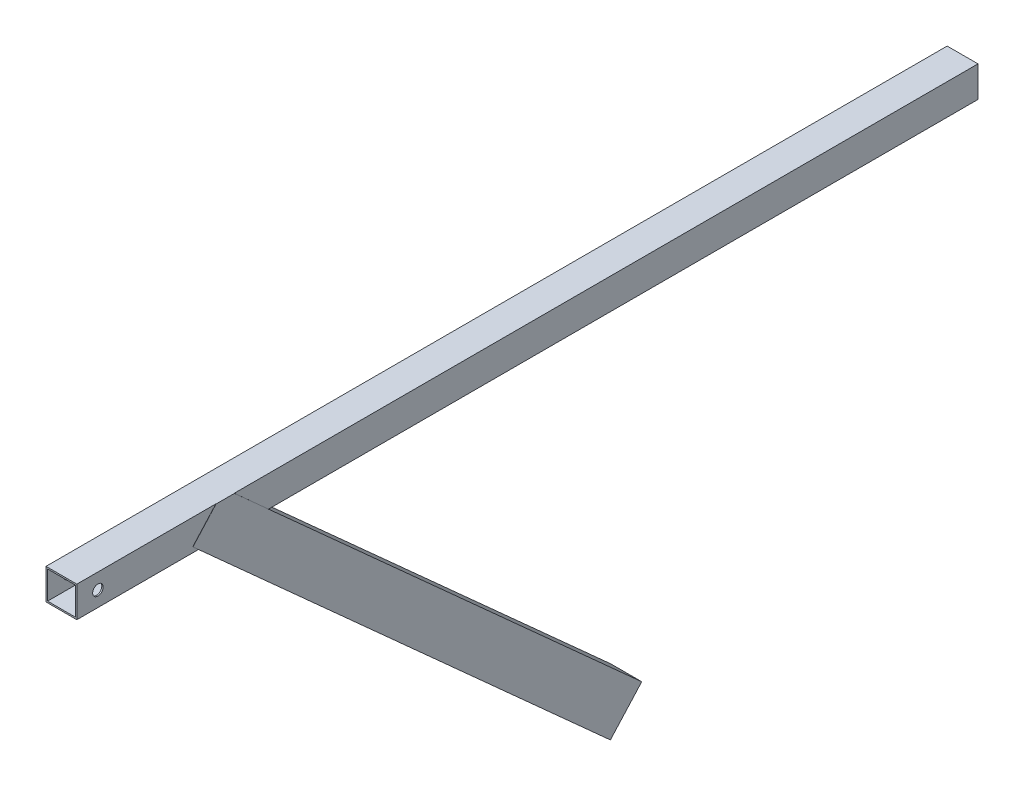
ISO-10303-21;
HEADER;
FILE_DESCRIPTION(('STEP AP214'),'2;1');
FILE_NAME('part.step','',(''),(''),'','','');
FILE_SCHEMA(('AUTOMOTIVE_DESIGN { 1 0 10303 214 1 1 1 1 }'));
ENDSEC;
DATA;
#1=APPLICATION_CONTEXT('core data for automotive mechanical design processes');
#2=APPLICATION_PROTOCOL_DEFINITION('international standard','automotive_design',2000,#1);
#3=PRODUCT_CONTEXT('',#1,'mechanical');
#4=PRODUCT('Part','Part','',(#3));
#5=PRODUCT_RELATED_PRODUCT_CATEGORY('part','',(#4));
#6=PRODUCT_DEFINITION_FORMATION('','',#4);
#7=PRODUCT_DEFINITION_CONTEXT('part definition',#1,'design');
#8=PRODUCT_DEFINITION('design','',#6,#7);
#9=PRODUCT_DEFINITION_SHAPE('','',#8);
#10=(LENGTH_UNIT() NAMED_UNIT(*) SI_UNIT(.MILLI.,.METRE.));
#11=(NAMED_UNIT(*) PLANE_ANGLE_UNIT() SI_UNIT($,.RADIAN.));
#12=(NAMED_UNIT(*) SI_UNIT($,.STERADIAN.) SOLID_ANGLE_UNIT());
#13=UNCERTAINTY_MEASURE_WITH_UNIT(LENGTH_MEASURE(1.E-05),#10,'distance_accuracy_value','');
#14=(GEOMETRIC_REPRESENTATION_CONTEXT(3) GLOBAL_UNCERTAINTY_ASSIGNED_CONTEXT((#13)) GLOBAL_UNIT_ASSIGNED_CONTEXT((#10,
#11,#12)) REPRESENTATION_CONTEXT('',''));
#15=CARTESIAN_POINT('',(0.,0.,0.));
#16=DIRECTION('',(0.,0.,1.));
#17=DIRECTION('',(1.,0.,0.));
#18=AXIS2_PLACEMENT_3D('',#15,#16,#17);
#19=CARTESIAN_POINT('',(0.,0.,385.));
#20=DIRECTION('',(-1.,0.,0.));
#21=DIRECTION('',(0.,0.,1.));
#22=AXIS2_PLACEMENT_3D('',#19,#20,#21);
#23=PLANE('',#22);
#24=DIRECTION('',(0.,0.669130606358841,0.74314482547741));
#25=VECTOR('',#24,1.);
#26=CARTESIAN_POINT('',(0.,81.4257064412463,311.683964610497));
#27=LINE('',#26,#25);
#28=CARTESIAN_POINT('',(0.,0.,221.251556008036));
#29=VERTEX_POINT('',#28);
#30=CARTESIAN_POINT('',(0.,26.3521827828498,250.518619999737));
#31=VERTEX_POINT('',#30);
#32=EDGE_CURVE('E247',#29,#31,#27,.T.);
#33=ORIENTED_EDGE('',*,*,#32,.F.);
#34=DIRECTION('',(0.,0.,-1.));
#35=VECTOR('',#34,1.);
#36=CARTESIAN_POINT('',(0.,0.,385.));
#37=LINE('',#36,#35);
#38=CARTESIAN_POINT('',(0.,0.,-385.));
#39=VERTEX_POINT('',#38);
#40=EDGE_CURVE('E388',#29,#39,#37,.T.);
#41=ORIENTED_EDGE('',*,*,#40,.T.);
#42=DIRECTION('',(0.,1.,0.));
#43=VECTOR('',#42,1.);
#44=CARTESIAN_POINT('',(0.,0.,-385.));
#45=LINE('',#44,#43);
#46=CARTESIAN_POINT('',(0.,26.3521827828498,-385.));
#47=VERTEX_POINT('',#46);
#48=EDGE_CURVE('E373',#39,#47,#45,.T.);
#49=ORIENTED_EDGE('',*,*,#48,.T.);
#50=DIRECTION('',(0.,0.,-1.));
#51=VECTOR('',#50,1.);
#52=CARTESIAN_POINT('',(0.,26.3521827828499,385.));
#53=LINE('',#52,#51);
#54=EDGE_CURVE('E412',#31,#47,#53,.T.);
#55=ORIENTED_EDGE('',*,*,#54,.F.);
#56=EDGE_LOOP('',(#33,#41,#49,#55));
#57=FACE_BOUND('',#56,.T.);
#58=ADVANCED_FACE('F39',(#57),#23,.F.);
#59=CARTESIAN_POINT('',(0.,0.,385.));
#60=DIRECTION('',(0.,1.,0.));
#61=DIRECTION('',(0.,0.,1.));
#62=AXIS2_PLACEMENT_3D('',#59,#60,#61);
#63=PLANE('',#62);
#64=DIRECTION('',(-1.,0.,0.));
#65=VECTOR('',#64,1.);
#66=CARTESIAN_POINT('',(0.,0.,281.030618002622));
#67=LINE('',#66,#65);
#68=CARTESIAN_POINT('',(0.,0.,281.030618002622));
#69=VERTEX_POINT('',#68);
#70=CARTESIAN_POINT('',(-26.3521827828498,-1.11022302462518E-13,281.030618002622));
#71=VERTEX_POINT('',#70);
#72=EDGE_CURVE('E300',#69,#71,#67,.T.);
#73=ORIENTED_EDGE('',*,*,#72,.F.);
#74=CARTESIAN_POINT('',(0.,0.,385.));
#75=VERTEX_POINT('',#74);
#76=EDGE_CURVE('E402',#75,#69,#37,.T.);
#77=ORIENTED_EDGE('',*,*,#76,.F.);
#78=DIRECTION('',(1.,0.,0.));
#79=VECTOR('',#78,1.);
#80=CARTESIAN_POINT('',(0.,0.,385.));
#81=LINE('',#80,#79);
#82=CARTESIAN_POINT('',(-26.3521827828498,-1.11022302462516E-13,385.));
#83=VERTEX_POINT('',#82);
#84=EDGE_CURVE('E385',#83,#75,#81,.T.);
#85=ORIENTED_EDGE('',*,*,#84,.F.);
#86=DIRECTION('',(0.,0.,-1.));
#87=VECTOR('',#86,1.);
#88=CARTESIAN_POINT('',(-26.3521827828498,-1.11022302462516E-13,385.));
#89=LINE('',#88,#87);
#90=EDGE_CURVE('E406',#83,#71,#89,.T.);
#91=ORIENTED_EDGE('',*,*,#90,.T.);
#92=EDGE_LOOP('',(#73,#77,#85,#91));
#93=FACE_BOUND('',#92,.T.);
#94=ADVANCED_FACE('F505',(#93),#63,.F.);
#95=DIRECTION('',(1.,0.,0.));
#96=VECTOR('',#95,1.);
#97=CARTESIAN_POINT('',(0.,0.,221.251556008036));
#98=LINE('',#97,#96);
#99=CARTESIAN_POINT('',(-26.3521827828498,-1.1102230246252E-13,221.251556008036));
#100=VERTEX_POINT('',#99);
#101=EDGE_CURVE('E291',#100,#29,#98,.T.);
#102=ORIENTED_EDGE('',*,*,#101,.F.);
#103=CARTESIAN_POINT('',(-26.3521827828498,-2.22044604925031E-13,-385.));
#104=VERTEX_POINT('',#103);
#105=EDGE_CURVE('E405',#100,#104,#89,.T.);
#106=ORIENTED_EDGE('',*,*,#105,.T.);
#107=DIRECTION('',(1.,0.,0.));
#108=VECTOR('',#107,1.);
#109=CARTESIAN_POINT('',(0.,0.,-385.));
#110=LINE('',#109,#108);
#111=EDGE_CURVE('E379',#104,#39,#110,.T.);
#112=ORIENTED_EDGE('',*,*,#111,.T.);
#113=ORIENTED_EDGE('',*,*,#40,.F.);
#114=EDGE_LOOP('',(#102,#106,#112,#113));
#115=FACE_BOUND('',#114,.T.);
#116=ADVANCED_FACE('F502',(#115),#63,.F.);
#117=CARTESIAN_POINT('',(-1.19133382852121,1.27609166327891,385.));
#118=DIRECTION('',(-1.,0.,0.));
#119=DIRECTION('',(0.,0.,1.));
#120=AXIS2_PLACEMENT_3D('',#117,#118,#119);
#121=PLANE('',#120);
#122=DIRECTION('',(0.,0.,-1.));
#123=VECTOR('',#122,1.);
#124=CARTESIAN_POINT('',(-1.19133382852121,1.27609166327891,385.));
#125=LINE('',#124,#123);
#126=CARTESIAN_POINT('',(-1.19133382852121,1.27609166327891,222.668799379343));
#127=VERTEX_POINT('',#126);
#128=CARTESIAN_POINT('',(-1.1913338285211,1.2760916632788,-385.));
#129=VERTEX_POINT('',#128);
#130=EDGE_CURVE('E339',#127,#129,#125,.T.);
#131=ORIENTED_EDGE('',*,*,#130,.F.);
#132=DIRECTION('',(0.,0.669130606358841,0.74314482547741));
#133=VECTOR('',#132,1.);
#134=CARTESIAN_POINT('',(-1.19133382852121,81.9970583226101,312.31851516031));
#135=LINE('',#134,#133);
#136=CARTESIAN_POINT('',(-1.1913338285211,25.0760916632791,249.101377232279));
#137=VERTEX_POINT('',#136);
#138=EDGE_CURVE('E288',#127,#137,#135,.T.);
#139=ORIENTED_EDGE('',*,*,#138,.T.);
#140=DIRECTION('',(0.,0.,-1.));
#141=VECTOR('',#140,1.);
#142=CARTESIAN_POINT('',(-1.19133382852121,25.0760916632791,385.));
#143=LINE('',#142,#141);
#144=CARTESIAN_POINT('',(-1.1913338285211,25.076091663279,-385.));
#145=VERTEX_POINT('',#144);
#146=EDGE_CURVE('E368',#137,#145,#143,.T.);
#147=ORIENTED_EDGE('',*,*,#146,.T.);
#148=DIRECTION('',(0.,1.,0.));
#149=VECTOR('',#148,1.);
#150=CARTESIAN_POINT('',(-1.1913338285211,1.2760916632788,-385.));
#151=LINE('',#150,#149);
#152=EDGE_CURVE('E324',#129,#145,#151,.T.);
#153=ORIENTED_EDGE('',*,*,#152,.F.);
#154=EDGE_LOOP('',(#131,#139,#147,#153));
#155=FACE_BOUND('',#154,.T.);
#156=ADVANCED_FACE('F504',(#155),#121,.T.);
#157=CARTESIAN_POINT('',(-1.19133382852121,25.0760916632791,385.));
#158=DIRECTION('',(0.,-1.,0.));
#159=DIRECTION('',(1.,0.,0.));
#160=AXIS2_PLACEMENT_3D('',#157,#158,#159);
#161=PLANE('',#160);
#162=ORIENTED_EDGE('',*,*,#146,.F.);
#163=DIRECTION('',(-1.,0.,0.));
#164=VECTOR('',#163,1.);
#165=CARTESIAN_POINT('',(-1.19133382852119,25.0760916632791,249.101377232279));
#166=LINE('',#165,#164);
#167=CARTESIAN_POINT('',(-24.9913338285211,25.076091663279,249.101377232279));
#168=VERTEX_POINT('',#167);
#169=EDGE_CURVE('E285',#137,#168,#166,.T.);
#170=ORIENTED_EDGE('',*,*,#169,.T.);
#171=DIRECTION('',(0.,0.,-1.));
#172=VECTOR('',#171,1.);
#173=CARTESIAN_POINT('',(-24.9913338285211,25.076091663279,385.));
#174=LINE('',#173,#172);
#175=CARTESIAN_POINT('',(-24.9913338285211,25.076091663279,-385.));
#176=VERTEX_POINT('',#175);
#177=EDGE_CURVE('E363',#168,#176,#174,.T.);
#178=ORIENTED_EDGE('',*,*,#177,.T.);
#179=DIRECTION('',(-1.,0.,0.));
#180=VECTOR('',#179,1.);
#181=CARTESIAN_POINT('',(-1.1913338285211,25.076091663279,-385.));
#182=LINE('',#181,#180);
#183=EDGE_CURVE('E343',#145,#176,#182,.T.);
#184=ORIENTED_EDGE('',*,*,#183,.F.);
#185=EDGE_LOOP('',(#162,#170,#178,#184));
#186=FACE_BOUND('',#185,.T.);
#187=ADVANCED_FACE('F512',(#186),#161,.T.);
#188=CARTESIAN_POINT('',(-24.9913338285211,1.27609166327891,385.));
#189=DIRECTION('',(1.,0.,0.));
#190=DIRECTION('',(0.,0.,-1.));
#191=AXIS2_PLACEMENT_3D('',#188,#189,#190);
#192=PLANE('',#191);
#193=ORIENTED_EDGE('',*,*,#177,.F.);
#194=DIRECTION('',(0.,-0.669130606358841,-0.74314482547741));
#195=VECTOR('',#194,1.);
#196=CARTESIAN_POINT('',(-24.9913338285211,81.9970583226101,312.31851516031));
#197=LINE('',#196,#195);
#198=CARTESIAN_POINT('',(-24.9913338285211,1.27609166327891,222.668799379343));
#199=VERTEX_POINT('',#198);
#200=EDGE_CURVE('E282',#168,#199,#197,.T.);
#201=ORIENTED_EDGE('',*,*,#200,.T.);
#202=DIRECTION('',(0.,0.,-1.));
#203=VECTOR('',#202,1.);
#204=CARTESIAN_POINT('',(-24.9913338285211,1.27609166327891,385.));
#205=LINE('',#204,#203);
#206=CARTESIAN_POINT('',(-24.9913338285211,1.2760916632788,-385.));
#207=VERTEX_POINT('',#206);
#208=EDGE_CURVE('E358',#199,#207,#205,.T.);
#209=ORIENTED_EDGE('',*,*,#208,.T.);
#210=DIRECTION('',(0.,-1.,0.));
#211=VECTOR('',#210,1.);
#212=CARTESIAN_POINT('',(-24.9913338285211,1.2760916632788,-385.));
#213=LINE('',#212,#211);
#214=EDGE_CURVE('E347',#176,#207,#213,.T.);
#215=ORIENTED_EDGE('',*,*,#214,.F.);
#216=EDGE_LOOP('',(#193,#201,#209,#215));
#217=FACE_BOUND('',#216,.T.);
#218=ADVANCED_FACE('F560',(#217),#192,.T.);
#219=CARTESIAN_POINT('',(-1.19133382852121,1.27609166327891,385.));
#220=DIRECTION('',(0.,1.,0.));
#221=DIRECTION('',(-1.,0.,0.));
#222=AXIS2_PLACEMENT_3D('',#219,#220,#221);
#223=PLANE('',#222);
#224=CARTESIAN_POINT('',(-1.19133382852121,1.27609166327891,385.));
#225=VERTEX_POINT('',#224);
#226=CARTESIAN_POINT('',(-1.1913338285211,1.27609166327891,282.447861373929));
#227=VERTEX_POINT('',#226);
#228=EDGE_CURVE('E354',#225,#227,#125,.T.);
#229=ORIENTED_EDGE('',*,*,#228,.T.);
#230=DIRECTION('',(-1.,0.,0.));
#231=VECTOR('',#230,1.);
#232=CARTESIAN_POINT('',(-1.1913338285212,1.27609166327891,282.447861373929));
#233=LINE('',#232,#231);
#234=CARTESIAN_POINT('',(-24.9913338285211,1.27609166327891,282.447861373929));
#235=VERTEX_POINT('',#234);
#236=EDGE_CURVE('E47',#227,#235,#233,.T.);
#237=ORIENTED_EDGE('',*,*,#236,.T.);
#238=CARTESIAN_POINT('',(-24.9913338285211,1.27609166327891,385.));
#239=VERTEX_POINT('',#238);
#240=EDGE_CURVE('E359',#239,#235,#205,.T.);
#241=ORIENTED_EDGE('',*,*,#240,.F.);
#242=DIRECTION('',(1.,0.,0.));
#243=VECTOR('',#242,1.);
#244=CARTESIAN_POINT('',(-1.19133382852121,1.27609166327891,385.));
#245=LINE('',#244,#243);
#246=EDGE_CURVE('E336',#239,#225,#245,.T.);
#247=ORIENTED_EDGE('',*,*,#246,.T.);
#248=EDGE_LOOP('',(#229,#237,#241,#247));
#249=FACE_BOUND('',#248,.T.);
#250=ADVANCED_FACE('F435',(#249),#223,.T.);
#251=ORIENTED_EDGE('',*,*,#208,.F.);
#252=DIRECTION('',(1.,0.,0.));
#253=VECTOR('',#252,1.);
#254=CARTESIAN_POINT('',(-1.19133382852119,1.27609166327891,222.668799379343));
#255=LINE('',#254,#253);
#256=EDGE_CURVE('E431',#199,#127,#255,.T.);
#257=ORIENTED_EDGE('',*,*,#256,.T.);
#258=ORIENTED_EDGE('',*,*,#130,.T.);
#259=DIRECTION('',(1.,0.,0.));
#260=VECTOR('',#259,1.);
#261=CARTESIAN_POINT('',(-1.1913338285211,1.2760916632788,-385.));
#262=LINE('',#261,#260);
#263=EDGE_CURVE('E329',#207,#129,#262,.T.);
#264=ORIENTED_EDGE('',*,*,#263,.F.);
#265=EDGE_LOOP('',(#251,#257,#258,#264));
#266=FACE_BOUND('',#265,.T.);
#267=ADVANCED_FACE('F556',(#266),#223,.T.);
#268=CARTESIAN_POINT('',(0.,0.,385.));
#269=DIRECTION('',(0.,0.,1.));
#270=DIRECTION('',(1.,0.,0.));
#271=AXIS2_PLACEMENT_3D('',#268,#269,#270);
#272=PLANE('',#271);
#273=DIRECTION('',(0.,1.,0.));
#274=VECTOR('',#273,1.);
#275=CARTESIAN_POINT('',(0.,0.,385.));
#276=LINE('',#275,#274);
#277=CARTESIAN_POINT('',(0.,26.3521827828499,385.));
#278=VERTEX_POINT('',#277);
#279=EDGE_CURVE('E374',#75,#278,#276,.T.);
#280=ORIENTED_EDGE('',*,*,#279,.T.);
#281=DIRECTION('',(-1.,0.,0.));
#282=VECTOR('',#281,1.);
#283=CARTESIAN_POINT('',(0.,26.3521827828499,385.));
#284=LINE('',#283,#282);
#285=CARTESIAN_POINT('',(-26.3521827828498,26.3521827828498,385.));
#286=VERTEX_POINT('',#285);
#287=EDGE_CURVE('E378',#278,#286,#284,.T.);
#288=ORIENTED_EDGE('',*,*,#287,.T.);
#289=DIRECTION('',(0.,-1.,0.));
#290=VECTOR('',#289,1.);
#291=CARTESIAN_POINT('',(-26.3521827828498,-1.11022302462516E-13,385.));
#292=LINE('',#291,#290);
#293=EDGE_CURVE('E382',#286,#83,#292,.T.);
#294=ORIENTED_EDGE('',*,*,#293,.T.);
#295=ORIENTED_EDGE('',*,*,#84,.T.);
#296=EDGE_LOOP('',(#280,#288,#294,#295));
#297=FACE_BOUND('',#296,.T.);
#298=DIRECTION('',(-1.,0.,0.));
#299=VECTOR('',#298,1.);
#300=CARTESIAN_POINT('',(-1.19133382852121,25.0760916632791,385.));
#301=LINE('',#300,#299);
#302=CARTESIAN_POINT('',(-1.19133382852121,25.0760916632791,385.));
#303=VERTEX_POINT('',#302);
#304=CARTESIAN_POINT('',(-24.9913338285211,25.076091663279,385.));
#305=VERTEX_POINT('',#304);
#306=EDGE_CURVE('E328',#303,#305,#301,.T.);
#307=ORIENTED_EDGE('',*,*,#306,.F.);
#308=DIRECTION('',(0.,1.,0.));
#309=VECTOR('',#308,1.);
#310=CARTESIAN_POINT('',(-1.19133382852121,1.27609166327891,385.));
#311=LINE('',#310,#309);
#312=EDGE_CURVE('E325',#225,#303,#311,.T.);
#313=ORIENTED_EDGE('',*,*,#312,.F.);
#314=ORIENTED_EDGE('',*,*,#246,.F.);
#315=DIRECTION('',(0.,-1.,0.));
#316=VECTOR('',#315,1.);
#317=CARTESIAN_POINT('',(-24.9913338285211,1.27609166327891,385.));
#318=LINE('',#317,#316);
#319=EDGE_CURVE('E332',#305,#239,#318,.T.);
#320=ORIENTED_EDGE('',*,*,#319,.F.);
#321=EDGE_LOOP('',(#307,#313,#314,#320));
#322=FACE_BOUND('',#321,.T.);
#323=ADVANCED_FACE('F448',(#297,#322),#272,.T.);
#324=CARTESIAN_POINT('',(0.,0.,-385.));
#325=DIRECTION('',(0.,0.,1.));
#326=DIRECTION('',(1.,0.,0.));
#327=AXIS2_PLACEMENT_3D('',#324,#325,#326);
#328=PLANE('',#327);
#329=ORIENTED_EDGE('',*,*,#48,.F.);
#330=ORIENTED_EDGE('',*,*,#111,.F.);
#331=DIRECTION('',(0.,-1.,0.));
#332=VECTOR('',#331,1.);
#333=CARTESIAN_POINT('',(-26.3521827828498,-2.22044604925031E-13,-385.));
#334=LINE('',#333,#332);
#335=CARTESIAN_POINT('',(-26.3521827828498,26.3521827828497,-385.));
#336=VERTEX_POINT('',#335);
#337=EDGE_CURVE('E395',#336,#104,#334,.T.);
#338=ORIENTED_EDGE('',*,*,#337,.F.);
#339=DIRECTION('',(-1.,0.,0.));
#340=VECTOR('',#339,1.);
#341=CARTESIAN_POINT('',(0.,26.3521827828498,-385.));
#342=LINE('',#341,#340);
#343=EDGE_CURVE('E392',#47,#336,#342,.T.);
#344=ORIENTED_EDGE('',*,*,#343,.F.);
#345=EDGE_LOOP('',(#329,#330,#338,#344));
#346=FACE_BOUND('',#345,.T.);
#347=ORIENTED_EDGE('',*,*,#152,.T.);
#348=ORIENTED_EDGE('',*,*,#183,.T.);
#349=ORIENTED_EDGE('',*,*,#214,.T.);
#350=ORIENTED_EDGE('',*,*,#263,.T.);
#351=EDGE_LOOP('',(#347,#348,#349,#350));
#352=FACE_BOUND('',#351,.T.);
#353=ADVANCED_FACE('F500',(#346,#352),#328,.F.);
#354=CARTESIAN_POINT('',(-2.22044604925031E-13,12.9999999999999,367.));
#355=DIRECTION('',(-1.,0.,0.));
#356=DIRECTION('',(0.,0.,1.));
#357=AXIS2_PLACEMENT_3D('',#354,#355,#356);
#358=CIRCLE('',#357,4.50000000000002);
#359=CARTESIAN_POINT('',(-2.22036958071899E-13,12.9999999999999,371.5));
#360=VERTEX_POINT('',#359);
#361=EDGE_CURVE('E312',#360,#360,#358,.T.);
#362=ORIENTED_EDGE('',*,*,#361,.T.);
#363=EDGE_LOOP('',(#362));
#364=FACE_BOUND('',#363,.T.);
#365=DIRECTION('',(0.,-0.669130606358841,-0.74314482547741));
#366=VECTOR('',#365,1.);
#367=CARTESIAN_POINT('',(0.,51.6999134221499,338.44918886485));
#368=LINE('',#367,#366);
#369=CARTESIAN_POINT('',(0.,4.44622979461925,285.968656456333));
#370=VERTEX_POINT('',#369);
#371=EDGE_CURVE('E62',#370,#69,#368,.T.);
#372=ORIENTED_EDGE('',*,*,#371,.F.);
#373=DIRECTION('',(0.,0.74314482547741,-0.669130606358841));
#374=VECTOR('',#373,1.);
#375=CARTESIAN_POINT('',(0.,-47.2536836275306,332.519467591483));
#376=LINE('',#375,#374);
#377=CARTESIAN_POINT('',(0.,26.3521827828498,266.244447791533));
#378=VERTEX_POINT('',#377);
#379=EDGE_CURVE('E309',#370,#378,#376,.T.);
#380=ORIENTED_EDGE('',*,*,#379,.T.);
#381=EDGE_CURVE('E413',#278,#378,#53,.T.);
#382=ORIENTED_EDGE('',*,*,#381,.F.);
#383=ORIENTED_EDGE('',*,*,#279,.F.);
#384=ORIENTED_EDGE('',*,*,#76,.T.);
#385=EDGE_LOOP('',(#372,#380,#382,#383,#384));
#386=FACE_BOUND('',#385,.T.);
#387=ADVANCED_FACE('F41',(#364,#386),#23,.F.);
#388=CARTESIAN_POINT('',(0.,26.3521827828499,385.));
#389=DIRECTION('',(0.,-1.,0.));
#390=DIRECTION('',(1.,0.,0.));
#391=AXIS2_PLACEMENT_3D('',#388,#389,#390);
#392=PLANE('',#391);
#393=ORIENTED_EDGE('',*,*,#343,.T.);
#394=DIRECTION('',(0.,0.,-1.));
#395=VECTOR('',#394,1.);
#396=CARTESIAN_POINT('',(-26.3521827828498,26.3521827828498,385.));
#397=LINE('',#396,#395);
#398=EDGE_CURVE('E409',#286,#336,#397,.T.);
#399=ORIENTED_EDGE('',*,*,#398,.F.);
#400=ORIENTED_EDGE('',*,*,#287,.F.);
#401=ORIENTED_EDGE('',*,*,#381,.T.);
#402=DIRECTION('',(-1.,0.,0.));
#403=VECTOR('',#402,1.);
#404=CARTESIAN_POINT('',(0.169515125807373,26.3521827828498,266.244447791533));
#405=LINE('',#404,#403);
#406=CARTESIAN_POINT('',(0.169515125807372,26.3521827828498,266.244447791533));
#407=VERTEX_POINT('',#406);
#408=EDGE_CURVE('E54',#407,#378,#405,.T.);
#409=ORIENTED_EDGE('',*,*,#408,.F.);
#410=DIRECTION('',(0.,0.,1.));
#411=VECTOR('',#410,1.);
#412=CARTESIAN_POINT('',(0.169515125807373,26.3521827828498,266.244447791533));
#413=LINE('',#412,#411);
#414=CARTESIAN_POINT('',(0.169515125807373,26.3521827828498,250.518619999737));
#415=VERTEX_POINT('',#414);
#416=EDGE_CURVE('E228',#415,#407,#413,.T.);
#417=ORIENTED_EDGE('',*,*,#416,.F.);
#418=DIRECTION('',(-1.,0.,0.));
#419=VECTOR('',#418,1.);
#420=CARTESIAN_POINT('',(0.169515125807373,26.3521827828498,250.518619999737));
#421=LINE('',#420,#419);
#422=EDGE_CURVE('E232',#415,#31,#421,.T.);
#423=ORIENTED_EDGE('',*,*,#422,.T.);
#424=ORIENTED_EDGE('',*,*,#54,.T.);
#425=EDGE_LOOP('',(#393,#399,#400,#401,#409,#417,#423,#424));
#426=FACE_BOUND('',#425,.T.);
#427=ADVANCED_FACE('F231',(#426),#392,.F.);
#428=CARTESIAN_POINT('',(-26.3521827828498,-1.11022302462516E-13,385.));
#429=DIRECTION('',(1.,0.,0.));
#430=DIRECTION('',(0.,0.,-1.));
#431=AXIS2_PLACEMENT_3D('',#428,#429,#430);
#432=PLANE('',#431);
#433=CARTESIAN_POINT('',(-26.35218278285,12.9999999999999,367.));
#434=DIRECTION('',(-1.,0.,0.));
#435=DIRECTION('',(0.,0.,1.));
#436=AXIS2_PLACEMENT_3D('',#433,#434,#435);
#437=CIRCLE('',#436,4.50000000000002);
#438=CARTESIAN_POINT('',(-26.35218278285,12.9999999999999,371.5));
#439=VERTEX_POINT('',#438);
#440=EDGE_CURVE('E311',#439,#439,#437,.T.);
#441=ORIENTED_EDGE('',*,*,#440,.F.);
#442=EDGE_LOOP('',(#441));
#443=FACE_BOUND('',#442,.T.);
#444=ORIENTED_EDGE('',*,*,#398,.T.);
#445=ORIENTED_EDGE('',*,*,#337,.T.);
#446=ORIENTED_EDGE('',*,*,#105,.F.);
#447=DIRECTION('',(0.,-0.669130606358841,-0.74314482547741));
#448=VECTOR('',#447,1.);
#449=CARTESIAN_POINT('',(-26.3521827828498,34.1720228137157,259.203432201979));
#450=LINE('',#449,#448);
#451=CARTESIAN_POINT('',(-26.3521827828498,-287.010668238528,-97.5060840271777));
#452=VERTEX_POINT('',#451);
#453=EDGE_CURVE('E255',#100,#452,#450,.T.);
#454=ORIENTED_EDGE('',*,*,#453,.T.);
#455=DIRECTION('',(0.,-0.74314482547741,0.669130606358841));
#456=VECTOR('',#455,1.);
#457=CARTESIAN_POINT('',(-26.3521827828498,-316.736461257624,-70.740859772824));
#458=LINE('',#457,#456);
#459=CARTESIAN_POINT('',(-26.3521827828498,-316.736461257624,-70.740859772824));
#460=VERTEX_POINT('',#459);
#461=EDGE_CURVE('E469',#452,#460,#458,.T.);
#462=ORIENTED_EDGE('',*,*,#461,.T.);
#463=DIRECTION('',(0.,-0.669130606358841,-0.74314482547741));
#464=VECTOR('',#463,1.);
#465=CARTESIAN_POINT('',(-26.3521827828498,4.44622979461928,285.968656456333));
#466=LINE('',#465,#464);
#467=EDGE_CURVE('E257',#71,#460,#466,.T.);
#468=ORIENTED_EDGE('',*,*,#467,.F.);
#469=ORIENTED_EDGE('',*,*,#90,.F.);
#470=ORIENTED_EDGE('',*,*,#293,.F.);
#471=EDGE_LOOP('',(#444,#445,#446,#454,#462,#468,#469,#470));
#472=FACE_BOUND('',#471,.T.);
#473=ADVANCED_FACE('F482',(#443,#472),#432,.F.);
#474=DIRECTION('',(0.,0.74314482547741,-0.669130606358841));
#475=VECTOR('',#474,1.);
#476=CARTESIAN_POINT('',(-1.19133382852121,-46.5489438456156,331.884917041669));
#477=LINE('',#476,#475);
#478=CARTESIAN_POINT('',(-1.19133382852121,4.44622979461928,285.968656456333));
#479=VERTEX_POINT('',#478);
#480=CARTESIAN_POINT('',(-1.1913338285211,25.0760916632791,267.393445396487));
#481=VERTEX_POINT('',#480);
#482=EDGE_CURVE('E307',#479,#481,#477,.T.);
#483=ORIENTED_EDGE('',*,*,#482,.F.);
#484=DIRECTION('',(0.,-0.669130606358841,-0.74314482547741));
#485=VECTOR('',#484,1.);
#486=CARTESIAN_POINT('',(-1.19133382852121,52.2712653035137,339.083739414664));
#487=LINE('',#486,#485);
#488=EDGE_CURVE('E297',#479,#227,#487,.T.);
#489=ORIENTED_EDGE('',*,*,#488,.T.);
#490=ORIENTED_EDGE('',*,*,#228,.F.);
#491=ORIENTED_EDGE('',*,*,#312,.T.);
#492=EDGE_CURVE('E369',#303,#481,#143,.T.);
#493=ORIENTED_EDGE('',*,*,#492,.T.);
#494=EDGE_LOOP('',(#483,#489,#490,#491,#493));
#495=FACE_BOUND('',#494,.T.);
#496=CARTESIAN_POINT('',(-1.19133382852132,12.9999999999999,367.));
#497=DIRECTION('',(-1.,0.,0.));
#498=DIRECTION('',(0.,0.,1.));
#499=AXIS2_PLACEMENT_3D('',#496,#497,#498);
#500=CIRCLE('',#499,4.50000000000002);
#501=CARTESIAN_POINT('',(-1.19133382852132,12.9999999999999,371.5));
#502=VERTEX_POINT('',#501);
#503=EDGE_CURVE('E320',#502,#502,#500,.T.);
#504=ORIENTED_EDGE('',*,*,#503,.F.);
#505=EDGE_LOOP('',(#504));
#506=FACE_BOUND('',#505,.T.);
#507=ADVANCED_FACE('F451',(#495,#506),#121,.T.);
#508=DIRECTION('',(-1.,0.,0.));
#509=VECTOR('',#508,1.);
#510=CARTESIAN_POINT('',(-1.19133382852123,25.0760916632791,267.393445396487));
#511=LINE('',#510,#509);
#512=CARTESIAN_POINT('',(-3.14569711277478,25.0760916632791,267.393445396487));
#513=VERTEX_POINT('',#512);
#514=EDGE_CURVE('E306',#481,#513,#511,.T.);
#515=ORIENTED_EDGE('',*,*,#514,.F.);
#516=ORIENTED_EDGE('',*,*,#492,.F.);
#517=ORIENTED_EDGE('',*,*,#306,.T.);
#518=CARTESIAN_POINT('',(-24.9913338285211,25.076091663279,267.393445396487));
#519=VERTEX_POINT('',#518);
#520=EDGE_CURVE('E364',#305,#519,#174,.T.);
#521=ORIENTED_EDGE('',*,*,#520,.T.);
#522=CARTESIAN_POINT('',(-23.0369705442676,25.0760916632791,267.393445396487));
#523=VERTEX_POINT('',#522);
#524=EDGE_CURVE('E304',#523,#519,#511,.T.);
#525=ORIENTED_EDGE('',*,*,#524,.F.);
#526=DIRECTION('',(0.,0.,1.));
#527=VECTOR('',#526,1.);
#528=CARTESIAN_POINT('',(-23.0369705442676,25.0760916632791,385.));
#529=LINE('',#528,#527);
#530=CARTESIAN_POINT('',(-23.0369705442676,25.0760916632791,256.573759981602));
#531=VERTEX_POINT('',#530);
#532=EDGE_CURVE('E277',#531,#523,#529,.T.);
#533=ORIENTED_EDGE('',*,*,#532,.F.);
#534=DIRECTION('',(-1.,0.,0.));
#535=VECTOR('',#534,1.);
#536=CARTESIAN_POINT('',(-1.19133382852119,25.0760916632791,256.573759981602));
#537=LINE('',#536,#535);
#538=CARTESIAN_POINT('',(-3.14569711277478,25.0760916632791,256.573759981602));
#539=VERTEX_POINT('',#538);
#540=EDGE_CURVE('E264',#539,#531,#537,.T.);
#541=ORIENTED_EDGE('',*,*,#540,.F.);
#542=DIRECTION('',(0.,0.,-1.));
#543=VECTOR('',#542,1.);
#544=CARTESIAN_POINT('',(-3.14569711277477,25.0760916632791,385.));
#545=LINE('',#544,#543);
#546=EDGE_CURVE('E269',#513,#539,#545,.T.);
#547=ORIENTED_EDGE('',*,*,#546,.F.);
#548=EDGE_LOOP('',(#515,#516,#517,#521,#525,#533,#541,#547));
#549=FACE_BOUND('',#548,.T.);
#550=ADVANCED_FACE('F559',(#549),#161,.T.);
#551=DIRECTION('',(0.,-0.74314482547741,0.669130606358841));
#552=VECTOR('',#551,1.);
#553=CARTESIAN_POINT('',(-24.9913338285211,-46.5489438456156,331.884917041669));
#554=LINE('',#553,#552);
#555=CARTESIAN_POINT('',(-24.9913338285211,4.44622979461928,285.968656456333));
#556=VERTEX_POINT('',#555);
#557=EDGE_CURVE('E11',#519,#556,#554,.T.);
#558=ORIENTED_EDGE('',*,*,#557,.F.);
#559=ORIENTED_EDGE('',*,*,#520,.F.);
#560=ORIENTED_EDGE('',*,*,#319,.T.);
#561=ORIENTED_EDGE('',*,*,#240,.T.);
#562=DIRECTION('',(0.,0.669130606358841,0.74314482547741));
#563=VECTOR('',#562,1.);
#564=CARTESIAN_POINT('',(-24.9913338285211,52.2712653035137,339.083739414664));
#565=LINE('',#564,#563);
#566=EDGE_CURVE('E294',#235,#556,#565,.T.);
#567=ORIENTED_EDGE('',*,*,#566,.T.);
#568=EDGE_LOOP('',(#558,#559,#560,#561,#567));
#569=FACE_BOUND('',#568,.T.);
#570=CARTESIAN_POINT('',(-24.9913338285214,13.,367.));
#571=DIRECTION('',(1.,0.,0.));
#572=DIRECTION('',(0.,0.,-1.));
#573=AXIS2_PLACEMENT_3D('',#570,#571,#572);
#574=CIRCLE('',#573,4.50000000000002);
#575=CARTESIAN_POINT('',(-24.9913338285214,13.,362.5));
#576=VERTEX_POINT('',#575);
#577=EDGE_CURVE('E316',#576,#576,#574,.T.);
#578=ORIENTED_EDGE('',*,*,#577,.F.);
#579=EDGE_LOOP('',(#578));
#580=FACE_BOUND('',#579,.T.);
#581=ADVANCED_FACE('F440',(#569,#580),#192,.T.);
#582=CARTESIAN_POINT('',(-2.22044604925031E-13,12.9999999999999,367.));
#583=DIRECTION('',(-1.,0.,0.));
#584=DIRECTION('',(0.,0.,1.));
#585=AXIS2_PLACEMENT_3D('',#582,#583,#584);
#586=CYLINDRICAL_SURFACE('',#585,4.50000000000002);
#587=ORIENTED_EDGE('',*,*,#577,.T.);
#588=EDGE_LOOP('',(#587));
#589=FACE_BOUND('',#588,.T.);
#590=ORIENTED_EDGE('',*,*,#440,.T.);
#591=EDGE_LOOP('',(#590));
#592=FACE_BOUND('',#591,.T.);
#593=ADVANCED_FACE('F535',(#589,#592),#586,.F.);
#594=ORIENTED_EDGE('',*,*,#503,.T.);
#595=EDGE_LOOP('',(#594));
#596=FACE_BOUND('',#595,.T.);
#597=ORIENTED_EDGE('',*,*,#361,.F.);
#598=EDGE_LOOP('',(#597));
#599=FACE_BOUND('',#598,.T.);
#600=ADVANCED_FACE('F532',(#596,#599),#586,.F.);
#601=CARTESIAN_POINT('',(-3.14569711277478,30.4562986863287,262.549085233773));
#602=DIRECTION('',(0.,-0.74314482547741,0.669130606358841));
#603=DIRECTION('',(0.,-0.669130606358841,-0.74314482547741));
#604=AXIS2_PLACEMENT_3D('',#601,#602,#603);
#605=PLANE('',#604);
#606=DIRECTION('',(0.,-0.669130606358841,-0.74314482547741));
#607=VECTOR('',#606,1.);
#608=CARTESIAN_POINT('',(-3.14569711277478,30.4562986863287,262.549085233773));
#609=LINE('',#608,#607);
#610=CARTESIAN_POINT('',(-3.14569711277478,1.27609166327891,230.141182128666));
#611=VERTEX_POINT('',#610);
#612=EDGE_CURVE('E607',#539,#611,#609,.T.);
#613=ORIENTED_EDGE('',*,*,#612,.F.);
#614=ORIENTED_EDGE('',*,*,#540,.T.);
#615=DIRECTION('',(0.,-0.669130606358841,-0.74314482547741));
#616=VECTOR('',#615,1.);
#617=CARTESIAN_POINT('',(-23.0369705442676,30.4562986863287,262.549085233773));
#618=LINE('',#617,#616);
#619=CARTESIAN_POINT('',(-23.0369705442676,1.27609166327891,230.141182128666));
#620=VERTEX_POINT('',#619);
#621=EDGE_CURVE('E605',#531,#620,#618,.T.);
#622=ORIENTED_EDGE('',*,*,#621,.T.);
#623=DIRECTION('',(1.,0.,0.));
#624=VECTOR('',#623,1.);
#625=CARTESIAN_POINT('',(-1.19133382852119,1.27609166327891,230.141182128666));
#626=LINE('',#625,#624);
#627=EDGE_CURVE('E416',#620,#611,#626,.T.);
#628=ORIENTED_EDGE('',*,*,#627,.T.);
#629=EDGE_LOOP('',(#613,#614,#622,#628));
#630=FACE_BOUND('',#629,.T.);
#631=ADVANCED_FACE('F534',(#630),#605,.T.);
#632=CARTESIAN_POINT('',(-3.14569711277478,8.16195392200636,282.623003424539));
#633=DIRECTION('',(-1.,0.,0.));
#634=DIRECTION('',(0.,0.,1.));
#635=AXIS2_PLACEMENT_3D('',#632,#633,#634);
#636=PLANE('',#635);
#637=DIRECTION('',(0.,0.74314482547741,-0.669130606358841));
#638=VECTOR('',#637,1.);
#639=CARTESIAN_POINT('',(-3.14569711277478,8.16195392200636,282.623003424539));
#640=LINE('',#639,#638);
#641=CARTESIAN_POINT('',(-3.14569711277478,8.16195392200636,282.623003424539));
#642=VERTEX_POINT('',#641);
#643=EDGE_CURVE('E593',#642,#513,#640,.T.);
#644=ORIENTED_EDGE('',*,*,#643,.T.);
#645=ORIENTED_EDGE('',*,*,#546,.T.);
#646=ORIENTED_EDGE('',*,*,#612,.T.);
#647=DIRECTION('',(0.,0.,1.));
#648=VECTOR('',#647,1.);
#649=CARTESIAN_POINT('',(-3.14569711277477,1.27609166327891,385.));
#650=LINE('',#649,#648);
#651=CARTESIAN_POINT('',(-3.14569711277478,1.27609166327892,274.975478624606));
#652=VERTEX_POINT('',#651);
#653=EDGE_CURVE('E422',#611,#652,#650,.T.);
#654=ORIENTED_EDGE('',*,*,#653,.T.);
#655=DIRECTION('',(0.,-0.669130606358841,-0.74314482547741));
#656=VECTOR('',#655,1.);
#657=CARTESIAN_POINT('',(-3.14569711277478,8.16195392200636,282.623003424539));
#658=LINE('',#657,#656);
#659=EDGE_CURVE('E608',#642,#652,#658,.T.);
#660=ORIENTED_EDGE('',*,*,#659,.F.);
#661=EDGE_LOOP('',(#644,#645,#646,#654,#660));
#662=FACE_BOUND('',#661,.T.);
#663=ADVANCED_FACE('F543',(#662),#636,.T.);
#664=CARTESIAN_POINT('',(-3.14569711277478,8.16195392200636,282.623003424539));
#665=DIRECTION('',(0.,0.74314482547741,-0.669130606358841));
#666=DIRECTION('',(0.,0.669130606358841,0.74314482547741));
#667=AXIS2_PLACEMENT_3D('',#664,#665,#666);
#668=PLANE('',#667);
#669=ORIENTED_EDGE('',*,*,#659,.T.);
#670=DIRECTION('',(-1.,0.,0.));
#671=VECTOR('',#670,1.);
#672=CARTESIAN_POINT('',(-1.1913338285212,1.27609166327891,274.975478624606));
#673=LINE('',#672,#671);
#674=CARTESIAN_POINT('',(-23.0369705442676,1.27609166327891,274.975478624606));
#675=VERTEX_POINT('',#674);
#676=EDGE_CURVE('E425',#652,#675,#673,.T.);
#677=ORIENTED_EDGE('',*,*,#676,.T.);
#678=DIRECTION('',(0.,-0.669130606358841,-0.74314482547741));
#679=VECTOR('',#678,1.);
#680=CARTESIAN_POINT('',(-23.0369705442676,8.16195392200636,282.623003424539));
#681=LINE('',#680,#679);
#682=CARTESIAN_POINT('',(-23.0369705442676,8.16195392200636,282.623003424539));
#683=VERTEX_POINT('',#682);
#684=EDGE_CURVE('E466',#683,#675,#681,.T.);
#685=ORIENTED_EDGE('',*,*,#684,.F.);
#686=DIRECTION('',(1.,0.,0.));
#687=VECTOR('',#686,1.);
#688=CARTESIAN_POINT('',(-3.14569711277478,8.16195392200636,282.623003424539));
#689=LINE('',#688,#687);
#690=EDGE_CURVE('E590',#683,#642,#689,.T.);
#691=ORIENTED_EDGE('',*,*,#690,.T.);
#692=EDGE_LOOP('',(#669,#677,#685,#691));
#693=FACE_BOUND('',#692,.T.);
#694=ADVANCED_FACE('F634',(#693),#668,.T.);
#695=CARTESIAN_POINT('',(-23.0369705442676,8.16195392200636,282.623003424539));
#696=DIRECTION('',(1.,0.,0.));
#697=DIRECTION('',(0.,1.,0.));
#698=AXIS2_PLACEMENT_3D('',#695,#696,#697);
#699=PLANE('',#698);
#700=ORIENTED_EDGE('',*,*,#621,.F.);
#701=ORIENTED_EDGE('',*,*,#532,.T.);
#702=DIRECTION('',(0.,-0.74314482547741,0.669130606358841));
#703=VECTOR('',#702,1.);
#704=CARTESIAN_POINT('',(-23.0369705442676,8.16195392200636,282.623003424539));
#705=LINE('',#704,#703);
#706=EDGE_CURVE('E588',#523,#683,#705,.T.);
#707=ORIENTED_EDGE('',*,*,#706,.T.);
#708=ORIENTED_EDGE('',*,*,#684,.T.);
#709=DIRECTION('',(0.,0.,-1.));
#710=VECTOR('',#709,1.);
#711=CARTESIAN_POINT('',(-23.0369705442676,1.27609166327891,385.));
#712=LINE('',#711,#710);
#713=EDGE_CURVE('E428',#675,#620,#712,.T.);
#714=ORIENTED_EDGE('',*,*,#713,.T.);
#715=EDGE_LOOP('',(#700,#701,#707,#708,#714));
#716=FACE_BOUND('',#715,.T.);
#717=ADVANCED_FACE('F629',(#716),#699,.T.);
#718=CARTESIAN_POINT('',(0.169515125807372,4.44622979461928,285.968656456333));
#719=DIRECTION('',(0.,0.74314482547741,-0.669130606358841));
#720=DIRECTION('',(0.,0.669130606358841,0.74314482547741));
#721=AXIS2_PLACEMENT_3D('',#718,#719,#720);
#722=PLANE('',#721);
#723=ORIENTED_EDGE('',*,*,#488,.F.);
#724=DIRECTION('',(1.,0.,0.));
#725=VECTOR('',#724,1.);
#726=CARTESIAN_POINT('',(0.169515125807372,4.44622979461928,285.968656456333));
#727=LINE('',#726,#725);
#728=EDGE_CURVE('E457',#556,#479,#727,.T.);
#729=ORIENTED_EDGE('',*,*,#728,.F.);
#730=ORIENTED_EDGE('',*,*,#566,.F.);
#731=ORIENTED_EDGE('',*,*,#236,.F.);
#732=EDGE_LOOP('',(#723,#729,#730,#731));
#733=FACE_BOUND('',#732,.T.);
#734=ADVANCED_FACE('F456',(#733),#722,.F.);
#735=CARTESIAN_POINT('',(0.,144.191781230861,160.141196770515));
#736=DIRECTION('',(0.,0.669130606358841,0.74314482547741));
#737=DIRECTION('',(0.,-0.74314482547741,0.669130606358841));
#738=AXIS2_PLACEMENT_3D('',#735,#736,#737);
#739=PLANE('',#738);
#740=ORIENTED_EDGE('',*,*,#728,.T.);
#741=ORIENTED_EDGE('',*,*,#482,.T.);
#742=ORIENTED_EDGE('',*,*,#514,.T.);
#743=ORIENTED_EDGE('',*,*,#643,.F.);
#744=ORIENTED_EDGE('',*,*,#690,.F.);
#745=ORIENTED_EDGE('',*,*,#706,.F.);
#746=ORIENTED_EDGE('',*,*,#524,.T.);
#747=ORIENTED_EDGE('',*,*,#557,.T.);
#748=EDGE_LOOP('',(#740,#741,#742,#743,#744,#745,#746,#747));
#749=FACE_BOUND('',#748,.T.);
#750=ADVANCED_FACE('F459',(#749),#739,.T.);
#751=ORIENTED_EDGE('',*,*,#713,.F.);
#752=ORIENTED_EDGE('',*,*,#676,.F.);
#753=ORIENTED_EDGE('',*,*,#653,.F.);
#754=ORIENTED_EDGE('',*,*,#627,.F.);
#755=EDGE_LOOP('',(#751,#752,#753,#754));
#756=FACE_BOUND('',#755,.T.);
#757=ADVANCED_FACE('F551',(#756),#223,.T.);
#758=CARTESIAN_POINT('',(0.169515125807372,34.1720228137157,259.203432201979));
#759=DIRECTION('',(0.,-0.74314482547741,0.669130606358841));
#760=DIRECTION('',(0.,-0.669130606358841,-0.74314482547741));
#761=AXIS2_PLACEMENT_3D('',#758,#759,#760);
#762=PLANE('',#761);
#763=ORIENTED_EDGE('',*,*,#138,.F.);
#764=ORIENTED_EDGE('',*,*,#256,.F.);
#765=ORIENTED_EDGE('',*,*,#200,.F.);
#766=ORIENTED_EDGE('',*,*,#169,.F.);
#767=EDGE_LOOP('',(#763,#764,#765,#766));
#768=FACE_BOUND('',#767,.T.);
#769=ADVANCED_FACE('F554',(#768),#762,.F.);
#770=ORIENTED_EDGE('',*,*,#408,.T.);
#771=ORIENTED_EDGE('',*,*,#379,.F.);
#772=CARTESIAN_POINT('',(0.169515125807372,4.44622979461928,285.968656456333));
#773=VERTEX_POINT('',#772);
#774=EDGE_CURVE('E461',#370,#773,#727,.T.);
#775=ORIENTED_EDGE('',*,*,#774,.T.);
#776=DIRECTION('',(0.,0.74314482547741,-0.669130606358841));
#777=VECTOR('',#776,1.);
#778=CARTESIAN_POINT('',(0.169515125807372,4.44622979461928,285.968656456333));
#779=LINE('',#778,#777);
#780=EDGE_CURVE('E259',#773,#407,#779,.T.);
#781=ORIENTED_EDGE('',*,*,#780,.T.);
#782=EDGE_LOOP('',(#770,#771,#775,#781));
#783=FACE_BOUND('',#782,.T.);
#784=ADVANCED_FACE('F581',(#783),#739,.T.);
#785=ORIENTED_EDGE('',*,*,#774,.F.);
#786=ORIENTED_EDGE('',*,*,#371,.T.);
#787=ORIENTED_EDGE('',*,*,#72,.T.);
#788=ORIENTED_EDGE('',*,*,#467,.T.);
#789=DIRECTION('',(1.,0.,0.));
#790=VECTOR('',#789,1.);
#791=CARTESIAN_POINT('',(0.169515125807371,-316.736461257624,-70.740859772824));
#792=LINE('',#791,#790);
#793=CARTESIAN_POINT('',(0.169515125807371,-316.736461257624,-70.740859772824));
#794=VERTEX_POINT('',#793);
#795=EDGE_CURVE('E472',#460,#794,#792,.T.);
#796=ORIENTED_EDGE('',*,*,#795,.T.);
#797=DIRECTION('',(0.,-0.669130606358841,-0.74314482547741));
#798=VECTOR('',#797,1.);
#799=CARTESIAN_POINT('',(0.169515125807372,4.44622979461928,285.968656456333));
#800=LINE('',#799,#798);
#801=EDGE_CURVE('E254',#773,#794,#800,.T.);
#802=ORIENTED_EDGE('',*,*,#801,.F.);
#803=EDGE_LOOP('',(#785,#786,#787,#788,#796,#802));
#804=FACE_BOUND('',#803,.T.);
#805=ADVANCED_FACE('F578',(#804),#722,.F.);
#806=ORIENTED_EDGE('',*,*,#32,.T.);
#807=ORIENTED_EDGE('',*,*,#422,.F.);
#808=DIRECTION('',(0.,-0.669130606358841,-0.74314482547741));
#809=VECTOR('',#808,1.);
#810=CARTESIAN_POINT('',(0.169515125807372,34.1720228137157,259.203432201979));
#811=LINE('',#810,#809);
#812=CARTESIAN_POINT('',(0.169515125807371,-287.010668238528,-97.5060840271777));
#813=VERTEX_POINT('',#812);
#814=EDGE_CURVE('E243',#415,#813,#811,.T.);
#815=ORIENTED_EDGE('',*,*,#814,.T.);
#816=DIRECTION('',(-1.,0.,0.));
#817=VECTOR('',#816,1.);
#818=CARTESIAN_POINT('',(0.169515125807371,-287.010668238528,-97.5060840271777));
#819=LINE('',#818,#817);
#820=EDGE_CURVE('E464',#813,#452,#819,.T.);
#821=ORIENTED_EDGE('',*,*,#820,.T.);
#822=ORIENTED_EDGE('',*,*,#453,.F.);
#823=ORIENTED_EDGE('',*,*,#101,.T.);
#824=EDGE_LOOP('',(#806,#807,#815,#821,#822,#823));
#825=FACE_BOUND('',#824,.T.);
#826=ADVANCED_FACE('F241',(#825),#762,.F.);
#827=DIRECTION('',(0.,0.,-1.));
#828=VECTOR('',#827,1.);
#829=CARTESIAN_POINT('',(-23.0369705442676,0.,385.));
#830=LINE('',#829,#828);
#831=CARTESIAN_POINT('',(-23.0369705442676,0.,273.558235253299));
#832=VERTEX_POINT('',#831);
#833=CARTESIAN_POINT('',(-23.0369705442676,0.,228.723938757359));
#834=VERTEX_POINT('',#833);
#835=EDGE_CURVE('E279',#832,#834,#830,.T.);
#836=ORIENTED_EDGE('',*,*,#835,.F.);
#837=CARTESIAN_POINT('',(-23.0369705442676,-313.020737130237,-74.0865128046182));
#838=VERTEX_POINT('',#837);
#839=EDGE_CURVE('E610',#832,#838,#681,.T.);
#840=ORIENTED_EDGE('',*,*,#839,.T.);
#841=DIRECTION('',(0.,-0.74314482547741,0.669130606358841));
#842=VECTOR('',#841,1.);
#843=CARTESIAN_POINT('',(-23.0369705442676,-313.020737130237,-74.0865128046182));
#844=LINE('',#843,#842);
#845=CARTESIAN_POINT('',(-23.0369705442676,-290.726392365915,-94.1604309953835));
#846=VERTEX_POINT('',#845);
#847=EDGE_CURVE('E582',#846,#838,#844,.T.);
#848=ORIENTED_EDGE('',*,*,#847,.F.);
#849=EDGE_CURVE('E595',#834,#846,#618,.T.);
#850=ORIENTED_EDGE('',*,*,#849,.F.);
#851=EDGE_LOOP('',(#836,#840,#848,#850));
#852=FACE_BOUND('',#851,.T.);
#853=ADVANCED_FACE('F643',(#852),#699,.T.);
#854=DIRECTION('',(-1.,0.,0.));
#855=VECTOR('',#854,1.);
#856=CARTESIAN_POINT('',(0.,0.,273.558235253299));
#857=LINE('',#856,#855);
#858=CARTESIAN_POINT('',(-3.14569711277478,0.,273.558235253299));
#859=VERTEX_POINT('',#858);
#860=EDGE_CURVE('E274',#859,#832,#857,.T.);
#861=ORIENTED_EDGE('',*,*,#860,.F.);
#862=CARTESIAN_POINT('',(-3.14569711277478,-313.020737130237,-74.0865128046182));
#863=VERTEX_POINT('',#862);
#864=EDGE_CURVE('E611',#859,#863,#658,.T.);
#865=ORIENTED_EDGE('',*,*,#864,.T.);
#866=DIRECTION('',(1.,0.,0.));
#867=VECTOR('',#866,1.);
#868=CARTESIAN_POINT('',(-3.14569711277478,-313.020737130237,-74.0865128046182));
#869=LINE('',#868,#867);
#870=EDGE_CURVE('E585',#838,#863,#869,.T.);
#871=ORIENTED_EDGE('',*,*,#870,.F.);
#872=ORIENTED_EDGE('',*,*,#839,.F.);
#873=EDGE_LOOP('',(#861,#865,#871,#872));
#874=FACE_BOUND('',#873,.T.);
#875=ADVANCED_FACE('F637',(#874),#668,.T.);
#876=DIRECTION('',(0.,0.,1.));
#877=VECTOR('',#876,1.);
#878=CARTESIAN_POINT('',(-3.14569711277477,0.,385.));
#879=LINE('',#878,#877);
#880=CARTESIAN_POINT('',(-3.14569711277478,0.,228.723938757359));
#881=VERTEX_POINT('',#880);
#882=EDGE_CURVE('E271',#881,#859,#879,.T.);
#883=ORIENTED_EDGE('',*,*,#882,.F.);
#884=CARTESIAN_POINT('',(-3.14569711277478,-290.726392365915,-94.1604309953835));
#885=VERTEX_POINT('',#884);
#886=EDGE_CURVE('E606',#881,#885,#609,.T.);
#887=ORIENTED_EDGE('',*,*,#886,.T.);
#888=DIRECTION('',(0.,0.74314482547741,-0.669130606358841));
#889=VECTOR('',#888,1.);
#890=CARTESIAN_POINT('',(-3.14569711277478,-313.020737130237,-74.0865128046182));
#891=LINE('',#890,#889);
#892=EDGE_CURVE('E599',#863,#885,#891,.T.);
#893=ORIENTED_EDGE('',*,*,#892,.F.);
#894=ORIENTED_EDGE('',*,*,#864,.F.);
#895=EDGE_LOOP('',(#883,#887,#893,#894));
#896=FACE_BOUND('',#895,.T.);
#897=ADVANCED_FACE('F645',(#896),#636,.T.);
#898=DIRECTION('',(1.,0.,0.));
#899=VECTOR('',#898,1.);
#900=CARTESIAN_POINT('',(0.,0.,228.723938757359));
#901=LINE('',#900,#899);
#902=EDGE_CURVE('E266',#834,#881,#901,.T.);
#903=ORIENTED_EDGE('',*,*,#902,.F.);
#904=ORIENTED_EDGE('',*,*,#849,.T.);
#905=DIRECTION('',(-1.,0.,0.));
#906=VECTOR('',#905,1.);
#907=CARTESIAN_POINT('',(-3.14569711277478,-290.726392365915,-94.1604309953835));
#908=LINE('',#907,#906);
#909=EDGE_CURVE('E591',#885,#846,#908,.T.);
#910=ORIENTED_EDGE('',*,*,#909,.F.);
#911=ORIENTED_EDGE('',*,*,#886,.F.);
#912=EDGE_LOOP('',(#903,#904,#910,#911));
#913=FACE_BOUND('',#912,.T.);
#914=ADVANCED_FACE('F546',(#913),#605,.T.);
#915=CARTESIAN_POINT('',(0.,-176.990909821383,-196.568319458642));
#916=DIRECTION('',(0.,0.669130606358841,0.74314482547741));
#917=DIRECTION('',(0.,-0.74314482547741,0.669130606358841));
#918=AXIS2_PLACEMENT_3D('',#915,#916,#917);
#919=PLANE('',#918);
#920=ORIENTED_EDGE('',*,*,#461,.F.);
#921=ORIENTED_EDGE('',*,*,#820,.F.);
#922=DIRECTION('',(0.,0.74314482547741,-0.669130606358841));
#923=VECTOR('',#922,1.);
#924=CARTESIAN_POINT('',(0.169515125807371,-316.736461257624,-70.740859772824));
#925=LINE('',#924,#923);
#926=EDGE_CURVE('E252',#794,#813,#925,.T.);
#927=ORIENTED_EDGE('',*,*,#926,.F.);
#928=ORIENTED_EDGE('',*,*,#795,.F.);
#929=EDGE_LOOP('',(#920,#921,#927,#928));
#930=FACE_BOUND('',#929,.T.);
#931=ORIENTED_EDGE('',*,*,#847,.T.);
#932=ORIENTED_EDGE('',*,*,#870,.T.);
#933=ORIENTED_EDGE('',*,*,#892,.T.);
#934=ORIENTED_EDGE('',*,*,#909,.T.);
#935=EDGE_LOOP('',(#931,#932,#933,#934));
#936=FACE_BOUND('',#935,.T.);
#937=ADVANCED_FACE('F478',(#930,#936),#919,.F.);
#938=CARTESIAN_POINT('',(0.169515125807372,4.44622979461928,285.968656456333));
#939=DIRECTION('',(-1.,0.,0.));
#940=DIRECTION('',(0.,0.,1.));
#941=AXIS2_PLACEMENT_3D('',#938,#939,#940);
#942=PLANE('',#941);
#943=ORIENTED_EDGE('',*,*,#814,.F.);
#944=ORIENTED_EDGE('',*,*,#416,.T.);
#945=ORIENTED_EDGE('',*,*,#780,.F.);
#946=ORIENTED_EDGE('',*,*,#801,.T.);
#947=ORIENTED_EDGE('',*,*,#926,.T.);
#948=EDGE_LOOP('',(#943,#944,#945,#946,#947));
#949=FACE_BOUND('',#948,.T.);
#950=ADVANCED_FACE('F249',(#949),#942,.F.);
#951=ORIENTED_EDGE('',*,*,#860,.T.);
#952=ORIENTED_EDGE('',*,*,#835,.T.);
#953=ORIENTED_EDGE('',*,*,#902,.T.);
#954=ORIENTED_EDGE('',*,*,#882,.T.);
#955=EDGE_LOOP('',(#951,#952,#953,#954));
#956=FACE_BOUND('',#955,.T.);
#957=ADVANCED_FACE('F507',(#956),#63,.F.);
#958=CLOSED_SHELL('',(#58,#94,#116,#156,#187,#218,#250,#267,#323,#353,#387,#427,#473,#507,#550,
#581,#593,#600,#631,#663,#694,#717,#734,#750,#757,#769,#784,#805,#826,#853,#875,#897,#914,#937,
#950,#957));
#959=MANIFOLD_SOLID_BREP('B2',#958);
#960=ADVANCED_BREP_SHAPE_REPRESENTATION('',(#18,#959),#14);
#961=SHAPE_DEFINITION_REPRESENTATION(#9,#960);
ENDSEC;
END-ISO-10303-21;
